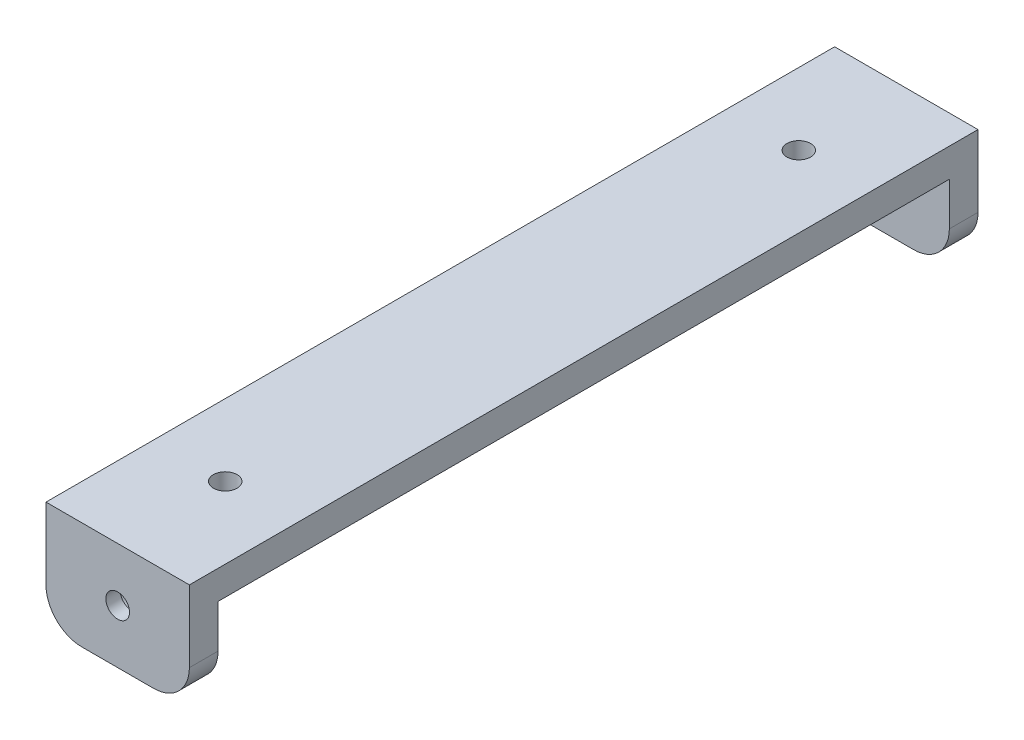
ISO-10303-21;
HEADER;
FILE_DESCRIPTION(('STEP AP214'),'2;1');
FILE_NAME('part.step','',(''),(''),'','','');
FILE_SCHEMA(('AUTOMOTIVE_DESIGN { 1 0 10303 214 1 1 1 1 }'));
ENDSEC;
DATA;
#1=APPLICATION_CONTEXT('core data for automotive mechanical design processes');
#2=APPLICATION_PROTOCOL_DEFINITION('international standard','automotive_design',2000,#1);
#3=PRODUCT_CONTEXT('',#1,'mechanical');
#4=PRODUCT('Part','Part','',(#3));
#5=PRODUCT_RELATED_PRODUCT_CATEGORY('part','',(#4));
#6=PRODUCT_DEFINITION_FORMATION('','',#4);
#7=PRODUCT_DEFINITION_CONTEXT('part definition',#1,'design');
#8=PRODUCT_DEFINITION('design','',#6,#7);
#9=PRODUCT_DEFINITION_SHAPE('','',#8);
#10=(LENGTH_UNIT() NAMED_UNIT(*) SI_UNIT(.MILLI.,.METRE.));
#11=(NAMED_UNIT(*) PLANE_ANGLE_UNIT() SI_UNIT($,.RADIAN.));
#12=(NAMED_UNIT(*) SI_UNIT($,.STERADIAN.) SOLID_ANGLE_UNIT());
#13=UNCERTAINTY_MEASURE_WITH_UNIT(LENGTH_MEASURE(1.E-05),#10,'distance_accuracy_value','');
#14=(GEOMETRIC_REPRESENTATION_CONTEXT(3) GLOBAL_UNCERTAINTY_ASSIGNED_CONTEXT((#13)) GLOBAL_UNIT_ASSIGNED_CONTEXT((#10,
#11,#12)) REPRESENTATION_CONTEXT('',''));
#15=CARTESIAN_POINT('',(0.,0.,0.));
#16=DIRECTION('',(0.,0.,1.));
#17=DIRECTION('',(1.,0.,0.));
#18=AXIS2_PLACEMENT_3D('',#15,#16,#17);
#19=CARTESIAN_POINT('',(-120.5,122.5,381.));
#20=DIRECTION('',(0.,0.,-1.));
#21=DIRECTION('',(0.,1.,0.));
#22=AXIS2_PLACEMENT_3D('',#19,#20,#21);
#23=CYLINDRICAL_SURFACE('',#22,1.65);
#24=CARTESIAN_POINT('',(-120.5,122.5,360.));
#25=DIRECTION('',(0.,0.,-1.));
#26=DIRECTION('',(0.,1.,0.));
#27=AXIS2_PLACEMENT_3D('',#24,#25,#26);
#28=CIRCLE('',#27,1.65);
#29=CARTESIAN_POINT('',(-120.5,124.15,360.));
#30=VERTEX_POINT('',#29);
#31=EDGE_CURVE('E362',#30,#30,#28,.F.);
#32=ORIENTED_EDGE('',*,*,#31,.T.);
#33=EDGE_LOOP('',(#32));
#34=FACE_BOUND('',#33,.T.);
#35=CARTESIAN_POINT('',(-120.5,122.5,358.));
#36=DIRECTION('',(0.,0.,1.));
#37=DIRECTION('',(0.,-1.,0.));
#38=AXIS2_PLACEMENT_3D('',#35,#36,#37);
#39=CIRCLE('',#38,1.65);
#40=CARTESIAN_POINT('',(-120.5,120.85,358.));
#41=VERTEX_POINT('',#40);
#42=EDGE_CURVE('E413',#41,#41,#39,.T.);
#43=ORIENTED_EDGE('',*,*,#42,.F.);
#44=EDGE_LOOP('',(#43));
#45=FACE_BOUND('',#44,.T.);
#46=ADVANCED_FACE('F16',(#34,#45),#23,.F.);
#47=CARTESIAN_POINT('',(-120.5,122.5,249.998));
#48=DIRECTION('',(0.,0.,1.));
#49=DIRECTION('',(0.,-1.,0.));
#50=AXIS2_PLACEMENT_3D('',#47,#48,#49);
#51=CYLINDRICAL_SURFACE('',#50,1.65);
#52=CARTESIAN_POINT('',(-120.5,122.5,250.));
#53=DIRECTION('',(0.,0.,-1.));
#54=DIRECTION('',(0.,1.,0.));
#55=AXIS2_PLACEMENT_3D('',#52,#53,#54);
#56=CIRCLE('',#55,1.65);
#57=CARTESIAN_POINT('',(-120.5,124.15,250.));
#58=VERTEX_POINT('',#57);
#59=EDGE_CURVE('E339',#58,#58,#56,.F.);
#60=ORIENTED_EDGE('',*,*,#59,.F.);
#61=EDGE_LOOP('',(#60));
#62=FACE_BOUND('',#61,.T.);
#63=CARTESIAN_POINT('',(-120.5,122.5,252.));
#64=DIRECTION('',(0.,0.,1.));
#65=DIRECTION('',(1.,0.,0.));
#66=AXIS2_PLACEMENT_3D('',#63,#64,#65);
#67=CIRCLE('',#66,1.65);
#68=CARTESIAN_POINT('',(-118.85,122.5,252.));
#69=VERTEX_POINT('',#68);
#70=EDGE_CURVE('E361',#69,#69,#67,.T.);
#71=ORIENTED_EDGE('',*,*,#70,.T.);
#72=EDGE_LOOP('',(#71));
#73=FACE_BOUND('',#72,.T.);
#74=ADVANCED_FACE('F386',(#62,#73),#51,.F.);
#75=CARTESIAN_POINT('',(0.,126.,312.5));
#76=DIRECTION('',(0.,1.,0.));
#77=DIRECTION('',(-1.,0.,0.));
#78=AXIS2_PLACEMENT_3D('',#75,#76,#77);
#79=PLANE('',#78);
#80=CARTESIAN_POINT('',(-120.5,126.,345.));
#81=DIRECTION('',(0.,1.,0.));
#82=DIRECTION('',(-1.,0.,0.));
#83=AXIS2_PLACEMENT_3D('',#80,#81,#82);
#84=CIRCLE('',#83,1.65);
#85=CARTESIAN_POINT('',(-122.15,126.,345.));
#86=VERTEX_POINT('',#85);
#87=EDGE_CURVE('E174',#86,#86,#84,.T.);
#88=ORIENTED_EDGE('',*,*,#87,.T.);
#89=EDGE_LOOP('',(#88));
#90=FACE_BOUND('',#89,.T.);
#91=CARTESIAN_POINT('',(-120.5,126.,265.));
#92=DIRECTION('',(0.,1.,0.));
#93=DIRECTION('',(-1.,0.,0.));
#94=AXIS2_PLACEMENT_3D('',#91,#92,#93);
#95=CIRCLE('',#94,1.65);
#96=CARTESIAN_POINT('',(-122.15,126.,265.));
#97=VERTEX_POINT('',#96);
#98=EDGE_CURVE('E182',#97,#97,#95,.T.);
#99=ORIENTED_EDGE('',*,*,#98,.T.);
#100=EDGE_LOOP('',(#99));
#101=FACE_BOUND('',#100,.T.);
#102=DIRECTION('',(0.,0.,-1.));
#103=VECTOR('',#102,1.);
#104=CARTESIAN_POINT('',(-110.5,126.,305.));
#105=LINE('',#104,#103);
#106=CARTESIAN_POINT('',(-110.5,126.,356.));
#107=VERTEX_POINT('',#106);
#108=CARTESIAN_POINT('',(-110.5,126.,254.));
#109=VERTEX_POINT('',#108);
#110=EDGE_CURVE('E141',#107,#109,#105,.T.);
#111=ORIENTED_EDGE('',*,*,#110,.F.);
#112=DIRECTION('',(-1.,0.,0.));
#113=VECTOR('',#112,1.);
#114=CARTESIAN_POINT('',(0.,126.,356.));
#115=LINE('',#114,#113);
#116=CARTESIAN_POINT('',(-130.5,126.,356.));
#117=VERTEX_POINT('',#116);
#118=EDGE_CURVE('E148',#107,#117,#115,.T.);
#119=ORIENTED_EDGE('',*,*,#118,.T.);
#120=DIRECTION('',(0.,0.,-1.));
#121=VECTOR('',#120,1.);
#122=CARTESIAN_POINT('',(-130.5,126.,305.));
#123=LINE('',#122,#121);
#124=CARTESIAN_POINT('',(-130.5,126.,254.));
#125=VERTEX_POINT('',#124);
#126=EDGE_CURVE('E165',#117,#125,#123,.T.);
#127=ORIENTED_EDGE('',*,*,#126,.T.);
#128=DIRECTION('',(-1.,0.,0.));
#129=VECTOR('',#128,1.);
#130=CARTESIAN_POINT('',(0.,126.,254.));
#131=LINE('',#130,#129);
#132=EDGE_CURVE('E162',#109,#125,#131,.T.);
#133=ORIENTED_EDGE('',*,*,#132,.F.);
#134=EDGE_LOOP('',(#111,#119,#127,#133));
#135=FACE_BOUND('',#134,.T.);
#136=ADVANCED_FACE('F160',(#90,#101,#135),#79,.F.);
#137=CARTESIAN_POINT('',(-130.5,126.,305.));
#138=DIRECTION('',(1.,0.,0.));
#139=DIRECTION('',(0.,0.,-1.));
#140=AXIS2_PLACEMENT_3D('',#137,#138,#139);
#141=PLANE('',#140);
#142=DIRECTION('',(0.,1.,0.));
#143=VECTOR('',#142,1.);
#144=CARTESIAN_POINT('',(-130.5,126.,250.));
#145=LINE('',#144,#143);
#146=CARTESIAN_POINT('',(-130.5,120.,250.));
#147=VERTEX_POINT('',#146);
#148=CARTESIAN_POINT('',(-130.5,130.,250.));
#149=VERTEX_POINT('',#148);
#150=EDGE_CURVE('E164',#147,#149,#145,.T.);
#151=ORIENTED_EDGE('',*,*,#150,.F.);
#152=DIRECTION('',(0.,0.,1.));
#153=VECTOR('',#152,1.);
#154=CARTESIAN_POINT('',(-130.5,120.,305.));
#155=LINE('',#154,#153);
#156=CARTESIAN_POINT('',(-130.5,120.,254.));
#157=VERTEX_POINT('',#156);
#158=EDGE_CURVE('E215',#147,#157,#155,.T.);
#159=ORIENTED_EDGE('',*,*,#158,.T.);
#160=DIRECTION('',(0.,1.,0.));
#161=VECTOR('',#160,1.);
#162=CARTESIAN_POINT('',(-130.5,115.,254.));
#163=LINE('',#162,#161);
#164=EDGE_CURVE('E189',#157,#125,#163,.T.);
#165=ORIENTED_EDGE('',*,*,#164,.T.);
#166=ORIENTED_EDGE('',*,*,#126,.F.);
#167=DIRECTION('',(0.,1.,0.));
#168=VECTOR('',#167,1.);
#169=CARTESIAN_POINT('',(-130.5,115.,356.));
#170=LINE('',#169,#168);
#171=CARTESIAN_POINT('',(-130.5,120.,356.));
#172=VERTEX_POINT('',#171);
#173=EDGE_CURVE('E149',#172,#117,#170,.T.);
#174=ORIENTED_EDGE('',*,*,#173,.F.);
#175=DIRECTION('',(0.,0.,-1.));
#176=VECTOR('',#175,1.);
#177=CARTESIAN_POINT('',(-130.5,120.,305.));
#178=LINE('',#177,#176);
#179=CARTESIAN_POINT('',(-130.5,120.,360.));
#180=VERTEX_POINT('',#179);
#181=EDGE_CURVE('E212',#172,#180,#178,.F.);
#182=ORIENTED_EDGE('',*,*,#181,.T.);
#183=DIRECTION('',(0.,1.,0.));
#184=VECTOR('',#183,1.);
#185=CARTESIAN_POINT('',(-130.5,126.,360.));
#186=LINE('',#185,#184);
#187=CARTESIAN_POINT('',(-130.5,130.,360.));
#188=VERTEX_POINT('',#187);
#189=EDGE_CURVE('E202',#180,#188,#186,.T.);
#190=ORIENTED_EDGE('',*,*,#189,.T.);
#191=DIRECTION('',(0.,0.,-1.));
#192=VECTOR('',#191,1.);
#193=CARTESIAN_POINT('',(-130.5,130.,305.));
#194=LINE('',#193,#192);
#195=EDGE_CURVE('E193',#188,#149,#194,.T.);
#196=ORIENTED_EDGE('',*,*,#195,.T.);
#197=EDGE_LOOP('',(#151,#159,#165,#166,#174,#182,#190,#196));
#198=FACE_BOUND('',#197,.T.);
#199=ADVANCED_FACE('F331',(#198),#141,.F.);
#200=CARTESIAN_POINT('',(180.,126.,360.));
#201=DIRECTION('',(0.,0.,-1.));
#202=DIRECTION('',(0.,1.,0.));
#203=AXIS2_PLACEMENT_3D('',#200,#201,#202);
#204=PLANE('',#203);
#205=ORIENTED_EDGE('',*,*,#31,.F.);
#206=EDGE_LOOP('',(#205));
#207=FACE_BOUND('',#206,.T.);
#208=DIRECTION('',(-1.,0.,0.));
#209=VECTOR('',#208,1.);
#210=CARTESIAN_POINT('',(180.,115.,360.));
#211=LINE('',#210,#209);
#212=CARTESIAN_POINT('',(-115.5,115.,360.));
#213=VERTEX_POINT('',#212);
#214=CARTESIAN_POINT('',(-125.5,115.,360.));
#215=VERTEX_POINT('',#214);
#216=EDGE_CURVE('E273',#213,#215,#211,.T.);
#217=ORIENTED_EDGE('',*,*,#216,.F.);
#218=CARTESIAN_POINT('',(-115.5,120.,360.));
#219=DIRECTION('',(0.,0.,-1.));
#220=DIRECTION('',(0.,1.,0.));
#221=AXIS2_PLACEMENT_3D('',#218,#219,#220);
#222=CIRCLE('',#221,5.);
#223=CARTESIAN_POINT('',(-110.5,120.,360.));
#224=VERTEX_POINT('',#223);
#225=EDGE_CURVE('E10',#213,#224,#222,.F.);
#226=ORIENTED_EDGE('',*,*,#225,.T.);
#227=DIRECTION('',(0.,1.,0.));
#228=VECTOR('',#227,1.);
#229=CARTESIAN_POINT('',(-110.5,126.,360.));
#230=LINE('',#229,#228);
#231=CARTESIAN_POINT('',(-110.5,130.,360.));
#232=VERTEX_POINT('',#231);
#233=EDGE_CURVE('E205',#224,#232,#230,.T.);
#234=ORIENTED_EDGE('',*,*,#233,.T.);
#235=DIRECTION('',(-1.,0.,0.));
#236=VECTOR('',#235,1.);
#237=CARTESIAN_POINT('',(180.,130.,360.));
#238=LINE('',#237,#236);
#239=EDGE_CURVE('E178',#232,#188,#238,.T.);
#240=ORIENTED_EDGE('',*,*,#239,.T.);
#241=ORIENTED_EDGE('',*,*,#189,.F.);
#242=CARTESIAN_POINT('',(-125.5,120.,360.));
#243=DIRECTION('',(0.,0.,-1.));
#244=DIRECTION('',(0.,1.,0.));
#245=AXIS2_PLACEMENT_3D('',#242,#243,#244);
#246=CIRCLE('',#245,5.);
#247=EDGE_CURVE('E25',#180,#215,#246,.F.);
#248=ORIENTED_EDGE('',*,*,#247,.T.);
#249=EDGE_LOOP('',(#217,#226,#234,#240,#241,#248));
#250=FACE_BOUND('',#249,.T.);
#251=ADVANCED_FACE('F326',(#207,#250),#204,.F.);
#252=CARTESIAN_POINT('',(-110.5,126.,305.));
#253=DIRECTION('',(1.,0.,0.));
#254=DIRECTION('',(0.,0.,-1.));
#255=AXIS2_PLACEMENT_3D('',#252,#253,#254);
#256=PLANE('',#255);
#257=DIRECTION('',(0.,1.,0.));
#258=VECTOR('',#257,1.);
#259=CARTESIAN_POINT('',(-110.5,115.,254.));
#260=LINE('',#259,#258);
#261=CARTESIAN_POINT('',(-110.5,120.,254.));
#262=VERTEX_POINT('',#261);
#263=EDGE_CURVE('E266',#262,#109,#260,.T.);
#264=ORIENTED_EDGE('',*,*,#263,.F.);
#265=DIRECTION('',(0.,0.,1.));
#266=VECTOR('',#265,1.);
#267=CARTESIAN_POINT('',(-110.5,120.,250.));
#268=LINE('',#267,#266);
#269=CARTESIAN_POINT('',(-110.5,120.,250.));
#270=VERTEX_POINT('',#269);
#271=EDGE_CURVE('E240',#262,#270,#268,.F.);
#272=ORIENTED_EDGE('',*,*,#271,.T.);
#273=DIRECTION('',(0.,1.,0.));
#274=VECTOR('',#273,1.);
#275=CARTESIAN_POINT('',(-110.5,126.,250.));
#276=LINE('',#275,#274);
#277=CARTESIAN_POINT('',(-110.5,130.,250.));
#278=VERTEX_POINT('',#277);
#279=EDGE_CURVE('E171',#270,#278,#276,.T.);
#280=ORIENTED_EDGE('',*,*,#279,.T.);
#281=DIRECTION('',(0.,0.,-1.));
#282=VECTOR('',#281,1.);
#283=CARTESIAN_POINT('',(-110.5,130.,305.));
#284=LINE('',#283,#282);
#285=EDGE_CURVE('E196',#232,#278,#284,.T.);
#286=ORIENTED_EDGE('',*,*,#285,.F.);
#287=ORIENTED_EDGE('',*,*,#233,.F.);
#288=DIRECTION('',(0.,0.,-1.));
#289=VECTOR('',#288,1.);
#290=CARTESIAN_POINT('',(-110.5,120.,356.));
#291=LINE('',#290,#289);
#292=CARTESIAN_POINT('',(-110.5,120.,356.));
#293=VERTEX_POINT('',#292);
#294=EDGE_CURVE('E145',#224,#293,#291,.T.);
#295=ORIENTED_EDGE('',*,*,#294,.T.);
#296=DIRECTION('',(0.,1.,0.));
#297=VECTOR('',#296,1.);
#298=CARTESIAN_POINT('',(-110.5,115.,356.));
#299=LINE('',#298,#297);
#300=EDGE_CURVE('E136',#293,#107,#299,.T.);
#301=ORIENTED_EDGE('',*,*,#300,.T.);
#302=ORIENTED_EDGE('',*,*,#110,.T.);
#303=EDGE_LOOP('',(#264,#272,#280,#286,#287,#295,#301,#302));
#304=FACE_BOUND('',#303,.T.);
#305=ADVANCED_FACE('F139',(#304),#256,.T.);
#306=CARTESIAN_POINT('',(-120.5,126.,345.));
#307=DIRECTION('',(0.,1.,0.));
#308=DIRECTION('',(0.,0.,1.));
#309=AXIS2_PLACEMENT_3D('',#306,#307,#308);
#310=CYLINDRICAL_SURFACE('',#309,1.65);
#311=ORIENTED_EDGE('',*,*,#87,.F.);
#312=EDGE_LOOP('',(#311));
#313=FACE_BOUND('',#312,.T.);
#314=CARTESIAN_POINT('',(-120.5,130.,345.));
#315=DIRECTION('',(0.,1.,0.));
#316=DIRECTION('',(-1.,0.,0.));
#317=AXIS2_PLACEMENT_3D('',#314,#315,#316);
#318=CIRCLE('',#317,1.65);
#319=CARTESIAN_POINT('',(-122.15,130.,345.));
#320=VERTEX_POINT('',#319);
#321=EDGE_CURVE('E188',#320,#320,#318,.T.);
#322=ORIENTED_EDGE('',*,*,#321,.T.);
#323=EDGE_LOOP('',(#322));
#324=FACE_BOUND('',#323,.T.);
#325=ADVANCED_FACE('F325',(#313,#324),#310,.F.);
#326=CARTESIAN_POINT('',(-120.5,126.,265.));
#327=DIRECTION('',(0.,1.,0.));
#328=DIRECTION('',(0.,0.,1.));
#329=AXIS2_PLACEMENT_3D('',#326,#327,#328);
#330=CYLINDRICAL_SURFACE('',#329,1.65);
#331=ORIENTED_EDGE('',*,*,#98,.F.);
#332=EDGE_LOOP('',(#331));
#333=FACE_BOUND('',#332,.T.);
#334=CARTESIAN_POINT('',(-120.5,130.,265.));
#335=DIRECTION('',(0.,1.,0.));
#336=DIRECTION('',(-1.,0.,0.));
#337=AXIS2_PLACEMENT_3D('',#334,#335,#336);
#338=CIRCLE('',#337,1.65);
#339=CARTESIAN_POINT('',(-122.15,130.,265.));
#340=VERTEX_POINT('',#339);
#341=EDGE_CURVE('E184',#340,#340,#338,.T.);
#342=ORIENTED_EDGE('',*,*,#341,.T.);
#343=EDGE_LOOP('',(#342));
#344=FACE_BOUND('',#343,.T.);
#345=ADVANCED_FACE('F351',(#333,#344),#330,.F.);
#346=CARTESIAN_POINT('',(-120.5,126.,250.));
#347=DIRECTION('',(0.,0.,-1.));
#348=DIRECTION('',(0.,1.,0.));
#349=AXIS2_PLACEMENT_3D('',#346,#347,#348);
#350=PLANE('',#349);
#351=ORIENTED_EDGE('',*,*,#59,.T.);
#352=EDGE_LOOP('',(#351));
#353=FACE_BOUND('',#352,.T.);
#354=DIRECTION('',(-1.,0.,0.));
#355=VECTOR('',#354,1.);
#356=CARTESIAN_POINT('',(-120.5,115.,250.));
#357=LINE('',#356,#355);
#358=CARTESIAN_POINT('',(-115.5,115.,250.));
#359=VERTEX_POINT('',#358);
#360=CARTESIAN_POINT('',(-125.5,115.,250.));
#361=VERTEX_POINT('',#360);
#362=EDGE_CURVE('E158',#359,#361,#357,.T.);
#363=ORIENTED_EDGE('',*,*,#362,.T.);
#364=CARTESIAN_POINT('',(-125.5,120.,250.));
#365=DIRECTION('',(0.,0.,-1.));
#366=DIRECTION('',(0.,1.,0.));
#367=AXIS2_PLACEMENT_3D('',#364,#365,#366);
#368=CIRCLE('',#367,5.);
#369=EDGE_CURVE('E235',#361,#147,#368,.T.);
#370=ORIENTED_EDGE('',*,*,#369,.T.);
#371=ORIENTED_EDGE('',*,*,#150,.T.);
#372=DIRECTION('',(-1.,0.,0.));
#373=VECTOR('',#372,1.);
#374=CARTESIAN_POINT('',(-120.5,130.,250.));
#375=LINE('',#374,#373);
#376=EDGE_CURVE('E183',#278,#149,#375,.T.);
#377=ORIENTED_EDGE('',*,*,#376,.F.);
#378=ORIENTED_EDGE('',*,*,#279,.F.);
#379=CARTESIAN_POINT('',(-115.5,120.,250.));
#380=DIRECTION('',(0.,0.,-1.));
#381=DIRECTION('',(0.,1.,0.));
#382=AXIS2_PLACEMENT_3D('',#379,#380,#381);
#383=CIRCLE('',#382,5.);
#384=EDGE_CURVE('E232',#270,#359,#383,.T.);
#385=ORIENTED_EDGE('',*,*,#384,.T.);
#386=EDGE_LOOP('',(#363,#370,#371,#377,#378,#385));
#387=FACE_BOUND('',#386,.T.);
#388=ADVANCED_FACE('F346',(#353,#387),#350,.T.);
#389=CARTESIAN_POINT('',(0.,130.,312.5));
#390=DIRECTION('',(0.,1.,0.));
#391=DIRECTION('',(-1.,0.,0.));
#392=AXIS2_PLACEMENT_3D('',#389,#390,#391);
#393=PLANE('',#392);
#394=ORIENTED_EDGE('',*,*,#376,.T.);
#395=ORIENTED_EDGE('',*,*,#195,.F.);
#396=ORIENTED_EDGE('',*,*,#239,.F.);
#397=ORIENTED_EDGE('',*,*,#285,.T.);
#398=EDGE_LOOP('',(#394,#395,#396,#397));
#399=FACE_BOUND('',#398,.T.);
#400=ORIENTED_EDGE('',*,*,#341,.F.);
#401=EDGE_LOOP('',(#400));
#402=FACE_BOUND('',#401,.T.);
#403=ORIENTED_EDGE('',*,*,#321,.F.);
#404=EDGE_LOOP('',(#403));
#405=FACE_BOUND('',#404,.T.);
#406=ADVANCED_FACE('F350',(#399,#402,#405),#393,.T.);
#407=CARTESIAN_POINT('',(-120.5,115.,254.));
#408=DIRECTION('',(0.,0.,-1.));
#409=DIRECTION('',(0.,1.,0.));
#410=AXIS2_PLACEMENT_3D('',#407,#408,#409);
#411=PLANE('',#410);
#412=CARTESIAN_POINT('',(-120.5,122.5,254.));
#413=DIRECTION('',(0.,0.,1.));
#414=DIRECTION('',(1.,0.,0.));
#415=AXIS2_PLACEMENT_3D('',#412,#413,#414);
#416=CIRCLE('',#415,3.);
#417=CARTESIAN_POINT('',(-117.5,122.5,254.));
#418=VERTEX_POINT('',#417);
#419=EDGE_CURVE('E357',#418,#418,#416,.T.);
#420=ORIENTED_EDGE('',*,*,#419,.F.);
#421=EDGE_LOOP('',(#420));
#422=FACE_BOUND('',#421,.T.);
#423=ORIENTED_EDGE('',*,*,#164,.F.);
#424=CARTESIAN_POINT('',(-125.5,120.,254.));
#425=DIRECTION('',(0.,0.,-1.));
#426=DIRECTION('',(0.,1.,0.));
#427=AXIS2_PLACEMENT_3D('',#424,#425,#426);
#428=CIRCLE('',#427,5.);
#429=CARTESIAN_POINT('',(-125.5,115.,254.));
#430=VERTEX_POINT('',#429);
#431=EDGE_CURVE('E222',#157,#430,#428,.F.);
#432=ORIENTED_EDGE('',*,*,#431,.T.);
#433=DIRECTION('',(-1.,0.,0.));
#434=VECTOR('',#433,1.);
#435=CARTESIAN_POINT('',(-120.5,115.,254.));
#436=LINE('',#435,#434);
#437=CARTESIAN_POINT('',(-115.5,115.,254.));
#438=VERTEX_POINT('',#437);
#439=EDGE_CURVE('E269',#438,#430,#436,.T.);
#440=ORIENTED_EDGE('',*,*,#439,.F.);
#441=CARTESIAN_POINT('',(-115.5,120.,254.));
#442=DIRECTION('',(0.,0.,-1.));
#443=DIRECTION('',(0.,1.,0.));
#444=AXIS2_PLACEMENT_3D('',#441,#442,#443);
#445=CIRCLE('',#444,5.);
#446=EDGE_CURVE('E219',#438,#262,#445,.F.);
#447=ORIENTED_EDGE('',*,*,#446,.T.);
#448=ORIENTED_EDGE('',*,*,#263,.T.);
#449=ORIENTED_EDGE('',*,*,#132,.T.);
#450=EDGE_LOOP('',(#423,#432,#440,#447,#448,#449));
#451=FACE_BOUND('',#450,.T.);
#452=ADVANCED_FACE('F312',(#422,#451),#411,.F.);
#453=CARTESIAN_POINT('',(0.,115.,312.5));
#454=DIRECTION('',(0.,1.,0.));
#455=DIRECTION('',(-1.,0.,0.));
#456=AXIS2_PLACEMENT_3D('',#453,#454,#455);
#457=PLANE('',#456);
#458=ORIENTED_EDGE('',*,*,#439,.T.);
#459=DIRECTION('',(0.,0.,1.));
#460=VECTOR('',#459,1.);
#461=CARTESIAN_POINT('',(-125.5,115.,312.5));
#462=LINE('',#461,#460);
#463=EDGE_CURVE('E229',#430,#361,#462,.F.);
#464=ORIENTED_EDGE('',*,*,#463,.T.);
#465=ORIENTED_EDGE('',*,*,#362,.F.);
#466=DIRECTION('',(0.,0.,1.));
#467=VECTOR('',#466,1.);
#468=CARTESIAN_POINT('',(-115.5,115.,254.));
#469=LINE('',#468,#467);
#470=EDGE_CURVE('E225',#359,#438,#469,.T.);
#471=ORIENTED_EDGE('',*,*,#470,.T.);
#472=EDGE_LOOP('',(#458,#464,#465,#471));
#473=FACE_BOUND('',#472,.T.);
#474=ADVANCED_FACE('F308',(#473),#457,.F.);
#475=CARTESIAN_POINT('',(-120.5,115.,356.));
#476=DIRECTION('',(0.,0.,-1.));
#477=DIRECTION('',(0.,1.,0.));
#478=AXIS2_PLACEMENT_3D('',#475,#476,#477);
#479=PLANE('',#478);
#480=CARTESIAN_POINT('',(-120.5,122.5,356.));
#481=DIRECTION('',(0.,0.,1.));
#482=DIRECTION('',(0.,-1.,0.));
#483=AXIS2_PLACEMENT_3D('',#480,#481,#482);
#484=CIRCLE('',#483,3.);
#485=CARTESIAN_POINT('',(-120.5,119.5,356.));
#486=VERTEX_POINT('',#485);
#487=EDGE_CURVE('E409',#486,#486,#484,.T.);
#488=ORIENTED_EDGE('',*,*,#487,.T.);
#489=EDGE_LOOP('',(#488));
#490=FACE_BOUND('',#489,.T.);
#491=ORIENTED_EDGE('',*,*,#300,.F.);
#492=CARTESIAN_POINT('',(-115.5,120.,356.));
#493=DIRECTION('',(0.,0.,-1.));
#494=DIRECTION('',(0.,1.,0.));
#495=AXIS2_PLACEMENT_3D('',#492,#493,#494);
#496=CIRCLE('',#495,5.);
#497=CARTESIAN_POINT('',(-115.5,115.,356.));
#498=VERTEX_POINT('',#497);
#499=EDGE_CURVE('E246',#293,#498,#496,.T.);
#500=ORIENTED_EDGE('',*,*,#499,.T.);
#501=DIRECTION('',(-1.,0.,0.));
#502=VECTOR('',#501,1.);
#503=CARTESIAN_POINT('',(-120.5,115.,356.));
#504=LINE('',#503,#502);
#505=CARTESIAN_POINT('',(-125.5,115.,356.));
#506=VERTEX_POINT('',#505);
#507=EDGE_CURVE('E343',#498,#506,#504,.T.);
#508=ORIENTED_EDGE('',*,*,#507,.T.);
#509=CARTESIAN_POINT('',(-125.5,120.,356.));
#510=DIRECTION('',(0.,0.,-1.));
#511=DIRECTION('',(0.,1.,0.));
#512=AXIS2_PLACEMENT_3D('',#509,#510,#511);
#513=CIRCLE('',#512,5.);
#514=EDGE_CURVE('E243',#506,#172,#513,.T.);
#515=ORIENTED_EDGE('',*,*,#514,.T.);
#516=ORIENTED_EDGE('',*,*,#173,.T.);
#517=ORIENTED_EDGE('',*,*,#118,.F.);
#518=EDGE_LOOP('',(#491,#500,#508,#515,#516,#517));
#519=FACE_BOUND('',#518,.T.);
#520=ADVANCED_FACE('F152',(#490,#519),#479,.T.);
#521=CARTESIAN_POINT('',(0.,115.,312.5));
#522=DIRECTION('',(0.,1.,0.));
#523=DIRECTION('',(-1.,0.,0.));
#524=AXIS2_PLACEMENT_3D('',#521,#522,#523);
#525=PLANE('',#524);
#526=ORIENTED_EDGE('',*,*,#507,.F.);
#527=DIRECTION('',(0.,0.,-1.));
#528=VECTOR('',#527,1.);
#529=CARTESIAN_POINT('',(-115.5,115.,360.));
#530=LINE('',#529,#528);
#531=EDGE_CURVE('E47',#498,#213,#530,.F.);
#532=ORIENTED_EDGE('',*,*,#531,.T.);
#533=ORIENTED_EDGE('',*,*,#216,.T.);
#534=DIRECTION('',(0.,0.,-1.));
#535=VECTOR('',#534,1.);
#536=CARTESIAN_POINT('',(-125.5,115.,312.5));
#537=LINE('',#536,#535);
#538=EDGE_CURVE('E249',#215,#506,#537,.T.);
#539=ORIENTED_EDGE('',*,*,#538,.T.);
#540=EDGE_LOOP('',(#526,#532,#533,#539));
#541=FACE_BOUND('',#540,.T.);
#542=ADVANCED_FACE('F292',(#541),#525,.F.);
#543=CARTESIAN_POINT('',(-125.5,120.,305.));
#544=DIRECTION('',(0.,0.,1.));
#545=DIRECTION('',(0.,-1.,0.));
#546=AXIS2_PLACEMENT_3D('',#543,#544,#545);
#547=CYLINDRICAL_SURFACE('',#546,5.);
#548=ORIENTED_EDGE('',*,*,#369,.F.);
#549=ORIENTED_EDGE('',*,*,#463,.F.);
#550=ORIENTED_EDGE('',*,*,#431,.F.);
#551=ORIENTED_EDGE('',*,*,#158,.F.);
#552=EDGE_LOOP('',(#548,#549,#550,#551));
#553=FACE_BOUND('',#552,.T.);
#554=ADVANCED_FACE('F283',(#553),#547,.T.);
#555=CARTESIAN_POINT('',(-115.5,120.,312.5));
#556=DIRECTION('',(0.,0.,-1.));
#557=DIRECTION('',(0.,1.,0.));
#558=AXIS2_PLACEMENT_3D('',#555,#556,#557);
#559=CYLINDRICAL_SURFACE('',#558,5.);
#560=ORIENTED_EDGE('',*,*,#384,.F.);
#561=ORIENTED_EDGE('',*,*,#271,.F.);
#562=ORIENTED_EDGE('',*,*,#446,.F.);
#563=ORIENTED_EDGE('',*,*,#470,.F.);
#564=EDGE_LOOP('',(#560,#561,#562,#563));
#565=FACE_BOUND('',#564,.T.);
#566=ADVANCED_FACE('F278',(#565),#559,.T.);
#567=CARTESIAN_POINT('',(-115.5,120.,305.));
#568=DIRECTION('',(0.,0.,1.));
#569=DIRECTION('',(0.,-1.,0.));
#570=AXIS2_PLACEMENT_3D('',#567,#568,#569);
#571=CYLINDRICAL_SURFACE('',#570,5.);
#572=ORIENTED_EDGE('',*,*,#225,.F.);
#573=ORIENTED_EDGE('',*,*,#531,.F.);
#574=ORIENTED_EDGE('',*,*,#499,.F.);
#575=ORIENTED_EDGE('',*,*,#294,.F.);
#576=EDGE_LOOP('',(#572,#573,#574,#575));
#577=FACE_BOUND('',#576,.T.);
#578=ADVANCED_FACE('F282',(#577),#571,.T.);
#579=CARTESIAN_POINT('',(-125.5,120.,312.5));
#580=DIRECTION('',(0.,0.,-1.));
#581=DIRECTION('',(0.,1.,0.));
#582=AXIS2_PLACEMENT_3D('',#579,#580,#581);
#583=CYLINDRICAL_SURFACE('',#582,5.);
#584=ORIENTED_EDGE('',*,*,#247,.F.);
#585=ORIENTED_EDGE('',*,*,#181,.F.);
#586=ORIENTED_EDGE('',*,*,#514,.F.);
#587=ORIENTED_EDGE('',*,*,#538,.F.);
#588=EDGE_LOOP('',(#584,#585,#586,#587));
#589=FACE_BOUND('',#588,.T.);
#590=ADVANCED_FACE('F18',(#589),#583,.T.);
#591=CARTESIAN_POINT('',(-120.5,122.5,252.));
#592=DIRECTION('',(0.,0.,1.));
#593=DIRECTION('',(0.,-1.,0.));
#594=AXIS2_PLACEMENT_3D('',#591,#592,#593);
#595=CYLINDRICAL_SURFACE('',#594,3.);
#596=CARTESIAN_POINT('',(-120.5,122.5,252.));
#597=DIRECTION('',(0.,0.,1.));
#598=DIRECTION('',(1.,0.,0.));
#599=AXIS2_PLACEMENT_3D('',#596,#597,#598);
#600=CIRCLE('',#599,3.);
#601=CARTESIAN_POINT('',(-117.5,122.5,252.));
#602=VERTEX_POINT('',#601);
#603=EDGE_CURVE('E344',#602,#602,#600,.T.);
#604=ORIENTED_EDGE('',*,*,#603,.F.);
#605=EDGE_LOOP('',(#604));
#606=FACE_BOUND('',#605,.T.);
#607=ORIENTED_EDGE('',*,*,#419,.T.);
#608=EDGE_LOOP('',(#607));
#609=FACE_BOUND('',#608,.T.);
#610=ADVANCED_FACE('F304',(#606,#609),#595,.F.);
#611=CARTESIAN_POINT('',(-64.0062539111404,120.5,252.));
#612=DIRECTION('',(0.,0.,1.));
#613=DIRECTION('',(1.,0.,0.));
#614=AXIS2_PLACEMENT_3D('',#611,#612,#613);
#615=PLANE('',#614);
#616=ORIENTED_EDGE('',*,*,#70,.F.);
#617=EDGE_LOOP('',(#616));
#618=FACE_BOUND('',#617,.T.);
#619=ORIENTED_EDGE('',*,*,#603,.T.);
#620=EDGE_LOOP('',(#619));
#621=FACE_BOUND('',#620,.T.);
#622=ADVANCED_FACE('F374',(#618,#621),#615,.T.);
#623=CARTESIAN_POINT('',(-120.5,122.5,358.));
#624=DIRECTION('',(0.,0.,-1.));
#625=DIRECTION('',(0.,1.,0.));
#626=AXIS2_PLACEMENT_3D('',#623,#624,#625);
#627=CYLINDRICAL_SURFACE('',#626,3.);
#628=CARTESIAN_POINT('',(-120.5,122.5,358.));
#629=DIRECTION('',(0.,0.,1.));
#630=DIRECTION('',(0.,-1.,0.));
#631=AXIS2_PLACEMENT_3D('',#628,#629,#630);
#632=CIRCLE('',#631,3.);
#633=CARTESIAN_POINT('',(-120.5,119.5,358.));
#634=VERTEX_POINT('',#633);
#635=EDGE_CURVE('E407',#634,#634,#632,.T.);
#636=ORIENTED_EDGE('',*,*,#635,.T.);
#637=EDGE_LOOP('',(#636));
#638=FACE_BOUND('',#637,.T.);
#639=ORIENTED_EDGE('',*,*,#487,.F.);
#640=EDGE_LOOP('',(#639));
#641=FACE_BOUND('',#640,.T.);
#642=ADVANCED_FACE('F381',(#638,#641),#627,.F.);
#643=CARTESIAN_POINT('',(-60.5062539111403,122.5,358.));
#644=DIRECTION('',(0.,0.,-1.));
#645=DIRECTION('',(1.,0.,0.));
#646=AXIS2_PLACEMENT_3D('',#643,#644,#645);
#647=PLANE('',#646);
#648=ORIENTED_EDGE('',*,*,#42,.T.);
#649=EDGE_LOOP('',(#648));
#650=FACE_BOUND('',#649,.T.);
#651=ORIENTED_EDGE('',*,*,#635,.F.);
#652=EDGE_LOOP('',(#651));
#653=FACE_BOUND('',#652,.T.);
#654=ADVANCED_FACE('F425',(#650,#653),#647,.T.);
#655=CLOSED_SHELL('',(#46,#74,#136,#199,#251,#305,#325,#345,#388,#406,#452,#474,#520,#542,#554,
#566,#578,#590,#610,#622,#642,#654));
#656=MANIFOLD_SOLID_BREP('B1',#655);
#657=ADVANCED_BREP_SHAPE_REPRESENTATION('',(#18,#656),#14);
#658=SHAPE_DEFINITION_REPRESENTATION(#9,#657);
ENDSEC;
END-ISO-10303-21;
